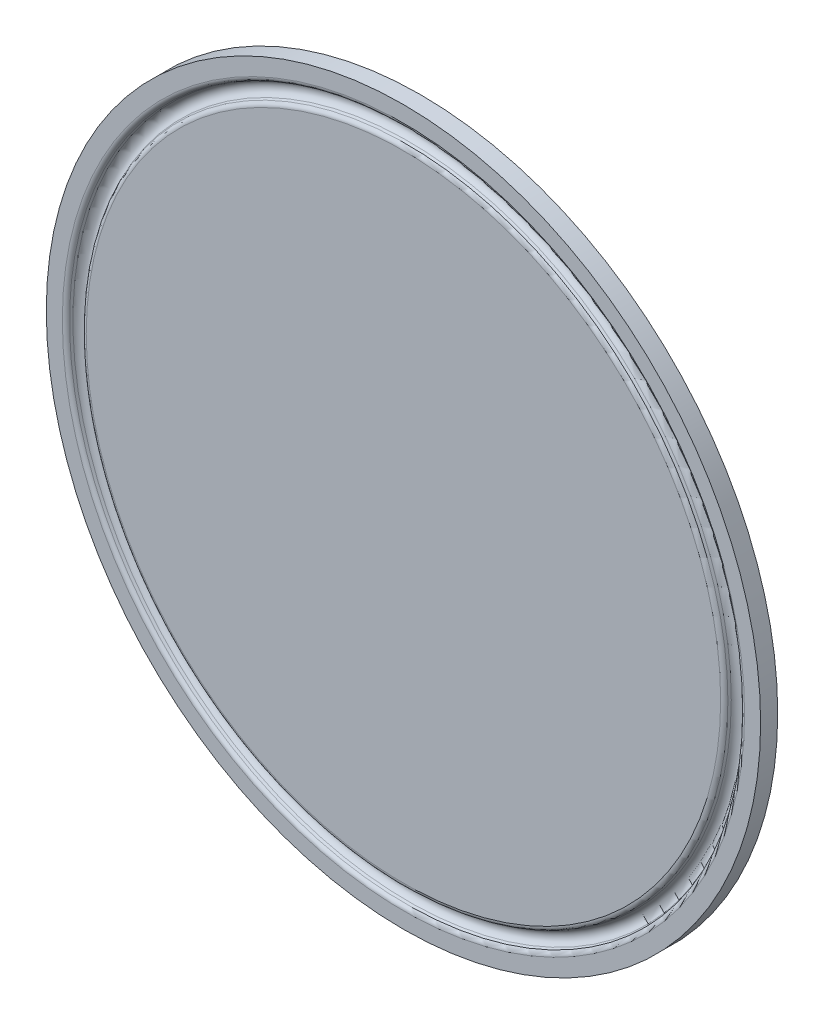
ISO-10303-21;
HEADER;
FILE_DESCRIPTION(('STEP AP214'),'2;1');
FILE_NAME('part.step','',(''),(''),'','','');
FILE_SCHEMA(('AUTOMOTIVE_DESIGN { 1 0 10303 214 1 1 1 1 }'));
ENDSEC;
DATA;
#1=APPLICATION_CONTEXT('core data for automotive mechanical design processes');
#2=APPLICATION_PROTOCOL_DEFINITION('international standard','automotive_design',2000,#1);
#3=PRODUCT_CONTEXT('',#1,'mechanical');
#4=PRODUCT('Part','Part','',(#3));
#5=PRODUCT_RELATED_PRODUCT_CATEGORY('part','',(#4));
#6=PRODUCT_DEFINITION_FORMATION('','',#4);
#7=PRODUCT_DEFINITION_CONTEXT('part definition',#1,'design');
#8=PRODUCT_DEFINITION('design','',#6,#7);
#9=PRODUCT_DEFINITION_SHAPE('','',#8);
#10=(LENGTH_UNIT() NAMED_UNIT(*) SI_UNIT(.MILLI.,.METRE.));
#11=(NAMED_UNIT(*) PLANE_ANGLE_UNIT() SI_UNIT($,.RADIAN.));
#12=(NAMED_UNIT(*) SI_UNIT($,.STERADIAN.) SOLID_ANGLE_UNIT());
#13=UNCERTAINTY_MEASURE_WITH_UNIT(LENGTH_MEASURE(1.E-05),#10,'distance_accuracy_value','');
#14=(GEOMETRIC_REPRESENTATION_CONTEXT(3) GLOBAL_UNCERTAINTY_ASSIGNED_CONTEXT((#13)) GLOBAL_UNIT_ASSIGNED_CONTEXT((#10,
#11,#12)) REPRESENTATION_CONTEXT('',''));
#15=CARTESIAN_POINT('',(0.,0.,0.));
#16=DIRECTION('',(0.,0.,1.));
#17=DIRECTION('',(1.,0.,0.));
#18=AXIS2_PLACEMENT_3D('',#15,#16,#17);
#19=CARTESIAN_POINT('',(0.,45.5042147091706,-7.9248));
#20=DIRECTION('',(0.,0.,1.));
#21=DIRECTION('',(1.,0.,0.));
#22=AXIS2_PLACEMENT_3D('',#19,#20,#21);
#23=PLANE('',#22);
#24=CARTESIAN_POINT('',(0.,0.,-7.9248));
#25=DIRECTION('',(0.,0.,1.));
#26=DIRECTION('',(1.,0.,0.));
#27=AXIS2_PLACEMENT_3D('',#24,#25,#26);
#28=CIRCLE('',#27,45.5042147091706);
#29=CARTESIAN_POINT('',(45.5042147091706,0.,-7.9248));
#30=VERTEX_POINT('',#29);
#31=EDGE_CURVE('E10',#30,#30,#28,.T.);
#32=ORIENTED_EDGE('',*,*,#31,.F.);
#33=EDGE_LOOP('',(#32));
#34=FACE_BOUND('',#33,.T.);
#35=ADVANCED_FACE('F39',(#34),#23,.F.);
#36=CARTESIAN_POINT('',(0.,0.,-7.9248));
#37=DIRECTION('',(0.,0.,1.));
#38=DIRECTION('',(1.,0.,0.));
#39=AXIS2_PLACEMENT_3D('',#36,#37,#38);
#40=CONICAL_SURFACE('',#39,45.5042147091706,1.22173047639603);
#41=CARTESIAN_POINT('',(0.,0.,-2.8448));
#42=DIRECTION('',(0.,0.,1.));
#43=DIRECTION('',(1.,0.,0.));
#44=AXIS2_PLACEMENT_3D('',#41,#42,#43);
#45=CIRCLE('',#44,59.4614);
#46=CARTESIAN_POINT('',(59.4614,0.,-2.8448));
#47=VERTEX_POINT('',#46);
#48=EDGE_CURVE('E45',#47,#47,#45,.T.);
#49=ORIENTED_EDGE('',*,*,#48,.F.);
#50=EDGE_LOOP('',(#49));
#51=FACE_BOUND('',#50,.T.);
#52=ORIENTED_EDGE('',*,*,#31,.T.);
#53=EDGE_LOOP('',(#52));
#54=FACE_BOUND('',#53,.T.);
#55=ADVANCED_FACE('F114',(#51,#54),#40,.T.);
#56=CARTESIAN_POINT('',(0.,0.,0.));
#57=DIRECTION('',(0.,0.,1.));
#58=DIRECTION('',(1.,0.,0.));
#59=AXIS2_PLACEMENT_3D('',#56,#57,#58);
#60=CYLINDRICAL_SURFACE('',#59,59.4614);
#61=CARTESIAN_POINT('',(0.,0.,0.));
#62=DIRECTION('',(0.,0.,1.));
#63=DIRECTION('',(1.,0.,0.));
#64=AXIS2_PLACEMENT_3D('',#61,#62,#63);
#65=CIRCLE('',#64,59.4614);
#66=CARTESIAN_POINT('',(59.4614,0.,0.));
#67=VERTEX_POINT('',#66);
#68=EDGE_CURVE('E49',#67,#67,#65,.T.);
#69=ORIENTED_EDGE('',*,*,#68,.F.);
#70=EDGE_LOOP('',(#69));
#71=FACE_BOUND('',#70,.T.);
#72=ORIENTED_EDGE('',*,*,#48,.T.);
#73=EDGE_LOOP('',(#72));
#74=FACE_BOUND('',#73,.T.);
#75=ADVANCED_FACE('F109',(#71,#74),#60,.T.);
#76=CARTESIAN_POINT('',(0.,56.7910722747395,0.));
#77=DIRECTION('',(0.,0.,-1.));
#78=DIRECTION('',(-1.,0.,0.));
#79=AXIS2_PLACEMENT_3D('',#76,#77,#78);
#80=PLANE('',#79);
#81=CARTESIAN_POINT('',(0.,0.,0.));
#82=DIRECTION('',(0.,0.,1.));
#83=DIRECTION('',(1.,0.,0.));
#84=AXIS2_PLACEMENT_3D('',#81,#82,#83);
#85=CIRCLE('',#84,56.7910722747395);
#86=CARTESIAN_POINT('',(56.7910722747395,0.,0.));
#87=VERTEX_POINT('',#86);
#88=EDGE_CURVE('E53',#87,#87,#85,.T.);
#89=ORIENTED_EDGE('',*,*,#88,.F.);
#90=EDGE_LOOP('',(#89));
#91=FACE_BOUND('',#90,.T.);
#92=ORIENTED_EDGE('',*,*,#68,.T.);
#93=EDGE_LOOP('',(#92));
#94=FACE_BOUND('',#93,.T.);
#95=ADVANCED_FACE('F103',(#91,#94),#80,.F.);
#96=CARTESIAN_POINT('',(0.,0.,-0.7874));
#97=DIRECTION('',(0.,0.,1.));
#98=DIRECTION('',(1.,0.,0.));
#99=AXIS2_PLACEMENT_3D('',#96,#97,#98);
#100=TOROIDAL_SURFACE('',#99,56.7910722747395,0.7874);
#101=CARTESIAN_POINT('',(0.,0.,-0.479738309427547));
#102=DIRECTION('',(0.,0.,1.));
#103=DIRECTION('',(1.,0.,0.));
#104=AXIS2_PLACEMENT_3D('',#101,#102,#103);
#105=CIRCLE('',#104,56.0662667531311);
#106=CARTESIAN_POINT('',(56.0662667531311,0.,-0.479738309427547));
#107=VERTEX_POINT('',#106);
#108=EDGE_CURVE('E58',#107,#107,#105,.T.);
#109=ORIENTED_EDGE('',*,*,#108,.F.);
#110=EDGE_LOOP('',(#109));
#111=FACE_BOUND('',#110,.T.);
#112=ORIENTED_EDGE('',*,*,#88,.T.);
#113=EDGE_LOOP('',(#112));
#114=FACE_BOUND('',#113,.T.);
#115=ADVANCED_FACE('F97',(#111,#114),#100,.T.);
#116=CARTESIAN_POINT('',(0.,0.,-0.479738309427547));
#117=DIRECTION('',(0.,0.,1.));
#118=DIRECTION('',(1.,0.,0.));
#119=AXIS2_PLACEMENT_3D('',#116,#117,#118);
#120=CONICAL_SURFACE('',#119,56.0662667531311,0.401425727958702);
#121=CARTESIAN_POINT('',(0.,0.,-0.872854821190493));
#122=DIRECTION('',(0.,0.,1.));
#123=DIRECTION('',(1.,0.,0.));
#124=AXIS2_PLACEMENT_3D('',#121,#122,#123);
#125=CIRCLE('',#124,55.8993986940515);
#126=CARTESIAN_POINT('',(55.8993986940515,0.,-0.872854821190493));
#127=VERTEX_POINT('',#126);
#128=EDGE_CURVE('E61',#127,#127,#125,.T.);
#129=ORIENTED_EDGE('',*,*,#128,.F.);
#130=EDGE_LOOP('',(#129));
#131=FACE_BOUND('',#130,.T.);
#132=ORIENTED_EDGE('',*,*,#108,.T.);
#133=EDGE_LOOP('',(#132));
#134=FACE_BOUND('',#133,.T.);
#135=ADVANCED_FACE('F91',(#131,#134),#120,.F.);
#136=CARTESIAN_POINT('',(0.,0.,-0.4064));
#137=DIRECTION('',(0.,0.,1.));
#138=DIRECTION('',(1.,0.,0.));
#139=AXIS2_PLACEMENT_3D('',#136,#137,#138);
#140=TOROIDAL_SURFACE('',#139,54.8005,1.1938);
#141=CARTESIAN_POINT('',(0.,0.,-0.872854821190503));
#142=DIRECTION('',(0.,0.,1.));
#143=DIRECTION('',(1.,0.,0.));
#144=AXIS2_PLACEMENT_3D('',#141,#142,#143);
#145=CIRCLE('',#144,53.7016013059485);
#146=CARTESIAN_POINT('',(53.7016013059485,0.,-0.872854821190503));
#147=VERTEX_POINT('',#146);
#148=EDGE_CURVE('E64',#147,#147,#145,.T.);
#149=ORIENTED_EDGE('',*,*,#148,.F.);
#150=EDGE_LOOP('',(#149));
#151=FACE_BOUND('',#150,.T.);
#152=ORIENTED_EDGE('',*,*,#128,.T.);
#153=EDGE_LOOP('',(#152));
#154=FACE_BOUND('',#153,.T.);
#155=ADVANCED_FACE('F85',(#151,#154),#140,.F.);
#156=CARTESIAN_POINT('',(0.,0.,-0.872854821190503));
#157=DIRECTION('',(0.,0.,-1.));
#158=DIRECTION('',(-1.,0.,0.));
#159=AXIS2_PLACEMENT_3D('',#156,#157,#158);
#160=CONICAL_SURFACE('',#159,53.7016013059485,0.401425727958718);
#161=CARTESIAN_POINT('',(0.,0.,-0.479738309427541));
#162=DIRECTION('',(0.,0.,1.));
#163=DIRECTION('',(1.,0.,0.));
#164=AXIS2_PLACEMENT_3D('',#161,#162,#163);
#165=CIRCLE('',#164,53.5347332468689);
#166=CARTESIAN_POINT('',(53.5347332468689,0.,-0.479738309427541));
#167=VERTEX_POINT('',#166);
#168=EDGE_CURVE('E67',#167,#167,#165,.T.);
#169=ORIENTED_EDGE('',*,*,#168,.F.);
#170=EDGE_LOOP('',(#169));
#171=FACE_BOUND('',#170,.T.);
#172=ORIENTED_EDGE('',*,*,#148,.T.);
#173=EDGE_LOOP('',(#172));
#174=FACE_BOUND('',#173,.T.);
#175=ADVANCED_FACE('F79',(#171,#174),#160,.T.);
#176=CARTESIAN_POINT('',(0.,0.,-0.7874));
#177=DIRECTION('',(0.,0.,1.));
#178=DIRECTION('',(1.,0.,0.));
#179=AXIS2_PLACEMENT_3D('',#176,#177,#178);
#180=TOROIDAL_SURFACE('',#179,52.8099277252605,0.787400000000005);
#181=CARTESIAN_POINT('',(0.,0.,0.));
#182=DIRECTION('',(0.,0.,1.));
#183=DIRECTION('',(1.,0.,0.));
#184=AXIS2_PLACEMENT_3D('',#181,#182,#183);
#185=CIRCLE('',#184,52.8099277252605);
#186=CARTESIAN_POINT('',(52.8099277252605,0.,0.));
#187=VERTEX_POINT('',#186);
#188=EDGE_CURVE('E70',#187,#187,#185,.T.);
#189=ORIENTED_EDGE('',*,*,#188,.F.);
#190=EDGE_LOOP('',(#189));
#191=FACE_BOUND('',#190,.T.);
#192=ORIENTED_EDGE('',*,*,#168,.T.);
#193=EDGE_LOOP('',(#192));
#194=FACE_BOUND('',#193,.T.);
#195=ADVANCED_FACE('F76',(#191,#194),#180,.T.);
#196=CARTESIAN_POINT('',(0.,0.,0.));
#197=DIRECTION('',(0.,0.,-1.));
#198=DIRECTION('',(-1.,0.,0.));
#199=AXIS2_PLACEMENT_3D('',#196,#197,#198);
#200=PLANE('',#199);
#201=ORIENTED_EDGE('',*,*,#188,.T.);
#202=EDGE_LOOP('',(#201));
#203=FACE_BOUND('',#202,.T.);
#204=ADVANCED_FACE('F74',(#203),#200,.F.);
#205=CLOSED_SHELL('',(#35,#55,#75,#95,#115,#135,#155,#175,#195,#204));
#206=MANIFOLD_SOLID_BREP('B2',#205);
#207=ADVANCED_BREP_SHAPE_REPRESENTATION('',(#18,#206),#14);
#208=SHAPE_DEFINITION_REPRESENTATION(#9,#207);
ENDSEC;
END-ISO-10303-21;
